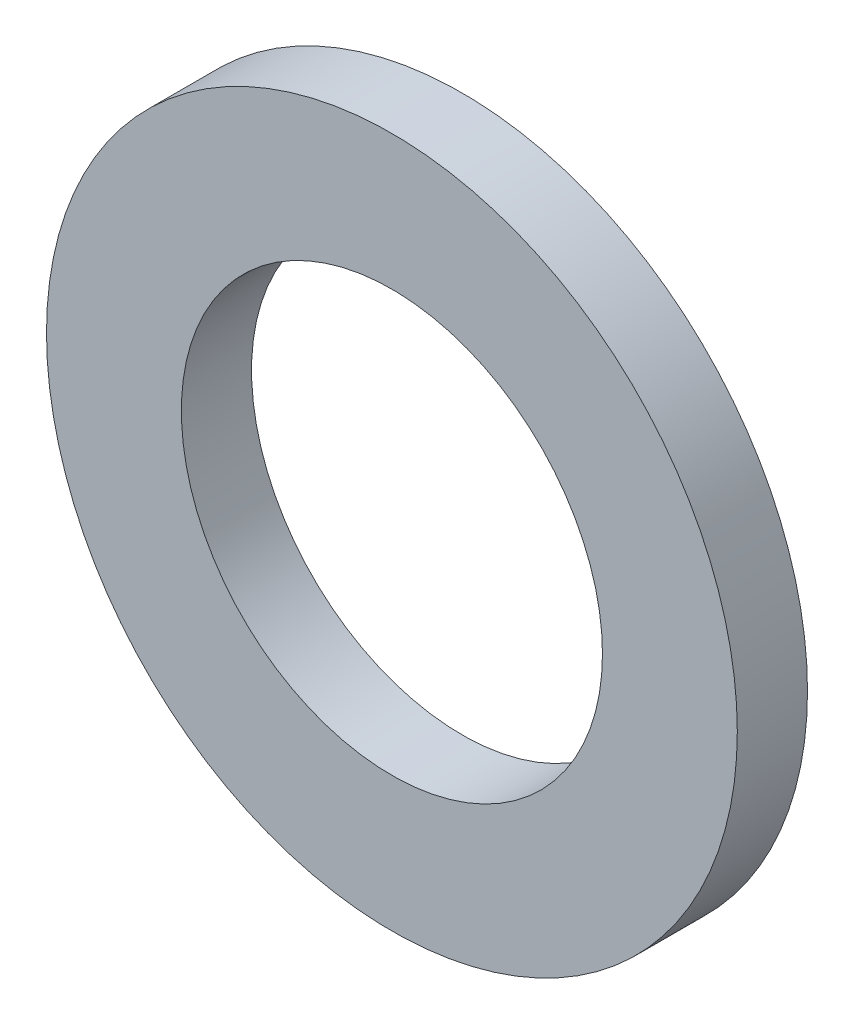
ISO-10303-21;
HEADER;
FILE_DESCRIPTION(('STEP AP214'),'2;1');
FILE_NAME('part.step','',(''),(''),'','','');
FILE_SCHEMA(('AUTOMOTIVE_DESIGN { 1 0 10303 214 1 1 1 1 }'));
ENDSEC;
DATA;
#1=APPLICATION_CONTEXT('core data for automotive mechanical design processes');
#2=APPLICATION_PROTOCOL_DEFINITION('international standard','automotive_design',2000,#1);
#3=PRODUCT_CONTEXT('',#1,'mechanical');
#4=PRODUCT('Part','Part','',(#3));
#5=PRODUCT_RELATED_PRODUCT_CATEGORY('part','',(#4));
#6=PRODUCT_DEFINITION_FORMATION('','',#4);
#7=PRODUCT_DEFINITION_CONTEXT('part definition',#1,'design');
#8=PRODUCT_DEFINITION('design','',#6,#7);
#9=PRODUCT_DEFINITION_SHAPE('','',#8);
#10=(LENGTH_UNIT() NAMED_UNIT(*) SI_UNIT(.MILLI.,.METRE.));
#11=(NAMED_UNIT(*) PLANE_ANGLE_UNIT() SI_UNIT($,.RADIAN.));
#12=(NAMED_UNIT(*) SI_UNIT($,.STERADIAN.) SOLID_ANGLE_UNIT());
#13=UNCERTAINTY_MEASURE_WITH_UNIT(LENGTH_MEASURE(1.E-05),#10,'distance_accuracy_value','');
#14=(GEOMETRIC_REPRESENTATION_CONTEXT(3) GLOBAL_UNCERTAINTY_ASSIGNED_CONTEXT((#13)) GLOBAL_UNIT_ASSIGNED_CONTEXT((#10,
#11,#12)) REPRESENTATION_CONTEXT('',''));
#15=CARTESIAN_POINT('',(0.,0.,0.));
#16=DIRECTION('',(0.,0.,1.));
#17=DIRECTION('',(1.,0.,0.));
#18=AXIS2_PLACEMENT_3D('',#15,#16,#17);
#19=CARTESIAN_POINT('',(0.,0.,-0.508));
#20=DIRECTION('',(0.,0.,1.));
#21=DIRECTION('',(1.,0.,0.));
#22=AXIS2_PLACEMENT_3D('',#19,#20,#21);
#23=CYLINDRICAL_SURFACE('',#22,2.5);
#24=CARTESIAN_POINT('',(0.,0.,-0.508));
#25=DIRECTION('',(0.,0.,1.));
#26=DIRECTION('',(1.,0.,0.));
#27=AXIS2_PLACEMENT_3D('',#24,#25,#26);
#28=CIRCLE('',#27,2.5);
#29=CARTESIAN_POINT('',(2.5,0.,-0.508));
#30=VERTEX_POINT('',#29);
#31=EDGE_CURVE('E10',#30,#30,#28,.T.);
#32=ORIENTED_EDGE('',*,*,#31,.T.);
#33=EDGE_LOOP('',(#32));
#34=FACE_BOUND('',#33,.T.);
#35=CARTESIAN_POINT('',(0.,0.,0.));
#36=DIRECTION('',(0.,0.,1.));
#37=DIRECTION('',(1.,0.,0.));
#38=AXIS2_PLACEMENT_3D('',#35,#36,#37);
#39=CIRCLE('',#38,2.5);
#40=CARTESIAN_POINT('',(2.5,0.,0.));
#41=VERTEX_POINT('',#40);
#42=EDGE_CURVE('E33',#41,#41,#39,.T.);
#43=ORIENTED_EDGE('',*,*,#42,.F.);
#44=EDGE_LOOP('',(#43));
#45=FACE_BOUND('',#44,.T.);
#46=ADVANCED_FACE('F30',(#34,#45),#23,.T.);
#47=CARTESIAN_POINT('',(0.,0.,-0.508));
#48=DIRECTION('',(0.,0.,1.));
#49=DIRECTION('',(1.,0.,0.));
#50=AXIS2_PLACEMENT_3D('',#47,#48,#49);
#51=PLANE('',#50);
#52=CARTESIAN_POINT('',(0.,0.,-0.508));
#53=DIRECTION('',(0.,0.,1.));
#54=DIRECTION('',(1.,0.,0.));
#55=AXIS2_PLACEMENT_3D('',#52,#53,#54);
#56=CIRCLE('',#55,1.524);
#57=CARTESIAN_POINT('',(1.524,0.,-0.508));
#58=VERTEX_POINT('',#57);
#59=EDGE_CURVE('E40',#58,#58,#56,.T.);
#60=ORIENTED_EDGE('',*,*,#59,.T.);
#61=EDGE_LOOP('',(#60));
#62=FACE_BOUND('',#61,.T.);
#63=ORIENTED_EDGE('',*,*,#31,.F.);
#64=EDGE_LOOP('',(#63));
#65=FACE_BOUND('',#64,.T.);
#66=ADVANCED_FACE('F48',(#62,#65),#51,.F.);
#67=CARTESIAN_POINT('',(0.,0.,0.));
#68=DIRECTION('',(0.,0.,1.));
#69=DIRECTION('',(1.,0.,0.));
#70=AXIS2_PLACEMENT_3D('',#67,#68,#69);
#71=PLANE('',#70);
#72=CARTESIAN_POINT('',(0.,0.,0.));
#73=DIRECTION('',(0.,0.,1.));
#74=DIRECTION('',(1.,0.,0.));
#75=AXIS2_PLACEMENT_3D('',#72,#73,#74);
#76=CIRCLE('',#75,1.524);
#77=CARTESIAN_POINT('',(1.524,0.,0.));
#78=VERTEX_POINT('',#77);
#79=EDGE_CURVE('E42',#78,#78,#76,.T.);
#80=ORIENTED_EDGE('',*,*,#79,.F.);
#81=EDGE_LOOP('',(#80));
#82=FACE_BOUND('',#81,.T.);
#83=ORIENTED_EDGE('',*,*,#42,.T.);
#84=EDGE_LOOP('',(#83));
#85=FACE_BOUND('',#84,.T.);
#86=ADVANCED_FACE('F54',(#82,#85),#71,.T.);
#87=CARTESIAN_POINT('',(0.,0.,-0.508));
#88=DIRECTION('',(0.,0.,1.));
#89=DIRECTION('',(1.,0.,0.));
#90=AXIS2_PLACEMENT_3D('',#87,#88,#89);
#91=CYLINDRICAL_SURFACE('',#90,1.524);
#92=ORIENTED_EDGE('',*,*,#59,.F.);
#93=EDGE_LOOP('',(#92));
#94=FACE_BOUND('',#93,.T.);
#95=ORIENTED_EDGE('',*,*,#79,.T.);
#96=EDGE_LOOP('',(#95));
#97=FACE_BOUND('',#96,.T.);
#98=ADVANCED_FACE('F51',(#94,#97),#91,.F.);
#99=CLOSED_SHELL('',(#46,#66,#86,#98));
#100=MANIFOLD_SOLID_BREP('B2',#99);
#101=ADVANCED_BREP_SHAPE_REPRESENTATION('',(#18,#100),#14);
#102=SHAPE_DEFINITION_REPRESENTATION(#9,#101);
ENDSEC;
END-ISO-10303-21;
